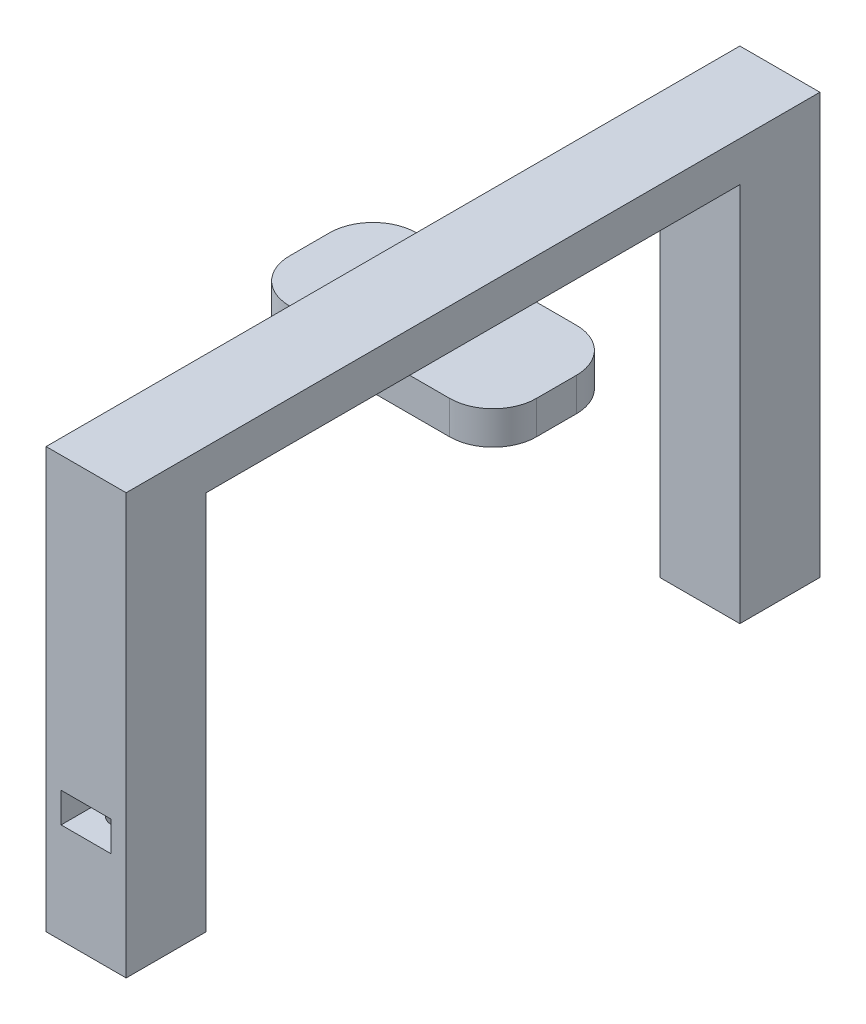
ISO-10303-21;
HEADER;
FILE_DESCRIPTION(('STEP AP214'),'2;1');
FILE_NAME('part.step','',(''),(''),'','','');
FILE_SCHEMA(('AUTOMOTIVE_DESIGN { 1 0 10303 214 1 1 1 1 }'));
ENDSEC;
DATA;
#1=APPLICATION_CONTEXT('core data for automotive mechanical design processes');
#2=APPLICATION_PROTOCOL_DEFINITION('international standard','automotive_design',2000,#1);
#3=PRODUCT_CONTEXT('',#1,'mechanical');
#4=PRODUCT('Part','Part','',(#3));
#5=PRODUCT_RELATED_PRODUCT_CATEGORY('part','',(#4));
#6=PRODUCT_DEFINITION_FORMATION('','',#4);
#7=PRODUCT_DEFINITION_CONTEXT('part definition',#1,'design');
#8=PRODUCT_DEFINITION('design','',#6,#7);
#9=PRODUCT_DEFINITION_SHAPE('','',#8);
#10=(LENGTH_UNIT() NAMED_UNIT(*) SI_UNIT(.MILLI.,.METRE.));
#11=(NAMED_UNIT(*) PLANE_ANGLE_UNIT() SI_UNIT($,.RADIAN.));
#12=(NAMED_UNIT(*) SI_UNIT($,.STERADIAN.) SOLID_ANGLE_UNIT());
#13=UNCERTAINTY_MEASURE_WITH_UNIT(LENGTH_MEASURE(1.E-05),#10,'distance_accuracy_value','');
#14=(GEOMETRIC_REPRESENTATION_CONTEXT(3) GLOBAL_UNCERTAINTY_ASSIGNED_CONTEXT((#13)) GLOBAL_UNIT_ASSIGNED_CONTEXT((#10,
#11,#12)) REPRESENTATION_CONTEXT('',''));
#15=CARTESIAN_POINT('',(0.,0.,0.));
#16=DIRECTION('',(0.,0.,1.));
#17=DIRECTION('',(1.,0.,0.));
#18=AXIS2_PLACEMENT_3D('',#15,#16,#17);
#19=CARTESIAN_POINT('',(-4.86740694674023,-12.,-47.9324410330826));
#20=DIRECTION('',(0.,-1.,0.));
#21=DIRECTION('',(0.,0.,-1.));
#22=AXIS2_PLACEMENT_3D('',#19,#20,#21);
#23=CYLINDRICAL_SURFACE('',#22,2.2);
#24=CARTESIAN_POINT('',(-4.86740694674023,-52.,-47.9324410330826));
#25=DIRECTION('',(0.,-1.,0.));
#26=DIRECTION('',(0.,0.,-1.));
#27=AXIS2_PLACEMENT_3D('',#24,#25,#26);
#28=CIRCLE('',#27,2.2);
#29=CARTESIAN_POINT('',(-4.86740694674023,-52.,-50.1324410330826));
#30=VERTEX_POINT('',#29);
#31=EDGE_CURVE('E279',#30,#30,#28,.T.);
#32=ORIENTED_EDGE('',*,*,#31,.T.);
#33=EDGE_LOOP('',(#32));
#34=FACE_BOUND('',#33,.T.);
#35=CARTESIAN_POINT('',(-4.86740694674023,-37.,-47.9324410330826));
#36=DIRECTION('',(0.,1.,0.));
#37=DIRECTION('',(0.,0.,1.));
#38=AXIS2_PLACEMENT_3D('',#35,#36,#37);
#39=CIRCLE('',#38,2.2);
#40=CARTESIAN_POINT('',(-4.86740694674023,-37.,-45.7324410330826));
#41=VERTEX_POINT('',#40);
#42=EDGE_CURVE('E39',#41,#41,#39,.F.);
#43=ORIENTED_EDGE('',*,*,#42,.F.);
#44=EDGE_LOOP('',(#43));
#45=FACE_BOUND('',#44,.T.);
#46=ADVANCED_FACE('F35',(#34,#45),#23,.F.);
#47=CARTESIAN_POINT('',(-4.86740694674023,-12.,44.0675589669174));
#48=DIRECTION('',(0.,-1.,0.));
#49=DIRECTION('',(0.,0.,-1.));
#50=AXIS2_PLACEMENT_3D('',#47,#48,#49);
#51=CYLINDRICAL_SURFACE('',#50,2.2);
#52=CARTESIAN_POINT('',(-4.86740694674023,-52.,44.0675589669174));
#53=DIRECTION('',(0.,-1.,0.));
#54=DIRECTION('',(0.,0.,-1.));
#55=AXIS2_PLACEMENT_3D('',#52,#53,#54);
#56=CIRCLE('',#55,2.2);
#57=CARTESIAN_POINT('',(-4.86740694674023,-52.,41.8675589669174));
#58=VERTEX_POINT('',#57);
#59=EDGE_CURVE('E282',#58,#58,#56,.T.);
#60=ORIENTED_EDGE('',*,*,#59,.T.);
#61=EDGE_LOOP('',(#60));
#62=FACE_BOUND('',#61,.T.);
#63=CARTESIAN_POINT('',(-4.86740694674023,-37.,44.0675589669174));
#64=DIRECTION('',(0.,1.,0.));
#65=DIRECTION('',(-1.,0.,0.));
#66=AXIS2_PLACEMENT_3D('',#63,#64,#65);
#67=CIRCLE('',#66,2.2);
#68=CARTESIAN_POINT('',(-7.06740694674023,-37.,44.0675589669174));
#69=VERTEX_POINT('',#68);
#70=EDGE_CURVE('E286',#69,#69,#67,.F.);
#71=ORIENTED_EDGE('',*,*,#70,.F.);
#72=EDGE_LOOP('',(#71));
#73=FACE_BOUND('',#72,.T.);
#74=ADVANCED_FACE('F431',(#62,#73),#51,.F.);
#75=CARTESIAN_POINT('',(0.,5.,0.));
#76=DIRECTION('',(0.,1.,0.));
#77=DIRECTION('',(0.,0.,1.));
#78=AXIS2_PLACEMENT_3D('',#75,#76,#77);
#79=PLANE('',#78);
#80=DIRECTION('',(-1.,0.,0.));
#81=VECTOR('',#80,1.);
#82=CARTESIAN_POINT('',(0.,5.,-41.9324410330826));
#83=LINE('',#82,#81);
#84=CARTESIAN_POINT('',(1.13259305325977,5.,-41.9324410330825));
#85=VERTEX_POINT('',#84);
#86=CARTESIAN_POINT('',(-10.8674069467402,5.,-41.9324410330825));
#87=VERTEX_POINT('',#86);
#88=EDGE_CURVE('E302',#85,#87,#83,.T.);
#89=ORIENTED_EDGE('',*,*,#88,.F.);
#90=DIRECTION('',(0.,0.,-1.));
#91=VECTOR('',#90,1.);
#92=CARTESIAN_POINT('',(1.13259305325977,5.,50.0675589669174));
#93=LINE('',#92,#91);
#94=CARTESIAN_POINT('',(1.13259305325977,5.,-11.4324410330825));
#95=VERTEX_POINT('',#94);
#96=EDGE_CURVE('E332',#95,#85,#93,.T.);
#97=ORIENTED_EDGE('',*,*,#96,.F.);
#98=DIRECTION('',(-1.,0.,0.));
#99=VECTOR('',#98,1.);
#100=CARTESIAN_POINT('',(-23.3674069467402,5.,-11.4324410330826));
#101=LINE('',#100,#99);
#102=CARTESIAN_POINT('',(-10.8674069467402,5.,-11.4324410330826));
#103=VERTEX_POINT('',#102);
#104=EDGE_CURVE('E371',#95,#103,#101,.T.);
#105=ORIENTED_EDGE('',*,*,#104,.T.);
#106=DIRECTION('',(0.,0.,-1.));
#107=VECTOR('',#106,1.);
#108=CARTESIAN_POINT('',(-10.8674069467402,5.,50.0675589669174));
#109=LINE('',#108,#107);
#110=EDGE_CURVE('E47',#103,#87,#109,.T.);
#111=ORIENTED_EDGE('',*,*,#110,.T.);
#112=EDGE_LOOP('',(#89,#97,#105,#111));
#113=FACE_BOUND('',#112,.T.);
#114=ADVANCED_FACE('F438',(#113),#79,.F.);
#115=CARTESIAN_POINT('',(0.,5.,0.));
#116=DIRECTION('',(0.,1.,0.));
#117=DIRECTION('',(0.,0.,1.));
#118=AXIS2_PLACEMENT_3D('',#115,#116,#117);
#119=PLANE('',#118);
#120=DIRECTION('',(1.,0.,0.));
#121=VECTOR('',#120,1.);
#122=CARTESIAN_POINT('',(-23.3674069467402,5.,7.56755896691743));
#123=LINE('',#122,#121);
#124=CARTESIAN_POINT('',(-16.8674069467402,5.,7.56755896691743));
#125=VERTEX_POINT('',#124);
#126=CARTESIAN_POINT('',(-10.8674069467402,5.,7.56755896691743));
#127=VERTEX_POINT('',#126);
#128=EDGE_CURVE('E360',#125,#127,#123,.T.);
#129=ORIENTED_EDGE('',*,*,#128,.T.);
#130=EDGE_CURVE('E11',#127,#103,#109,.T.);
#131=ORIENTED_EDGE('',*,*,#130,.T.);
#132=CARTESIAN_POINT('',(-16.8674069467402,5.,-11.4324410330826));
#133=VERTEX_POINT('',#132);
#134=EDGE_CURVE('E367',#103,#133,#101,.T.);
#135=ORIENTED_EDGE('',*,*,#134,.T.);
#136=CARTESIAN_POINT('',(-16.8674069467402,5.,-4.93244103308257));
#137=DIRECTION('',(0.,1.,0.));
#138=DIRECTION('',(0.,0.,1.));
#139=AXIS2_PLACEMENT_3D('',#136,#137,#138);
#140=CIRCLE('',#139,6.5);
#141=CARTESIAN_POINT('',(-23.3674069467402,5.,-4.93244103308256));
#142=VERTEX_POINT('',#141);
#143=EDGE_CURVE('E406',#133,#142,#140,.T.);
#144=ORIENTED_EDGE('',*,*,#143,.T.);
#145=DIRECTION('',(0.,0.,1.));
#146=VECTOR('',#145,1.);
#147=CARTESIAN_POINT('',(-23.3674069467402,5.,-11.4324410330826));
#148=LINE('',#147,#146);
#149=CARTESIAN_POINT('',(-23.3674069467402,5.,1.06755896691744));
#150=VERTEX_POINT('',#149);
#151=EDGE_CURVE('E355',#142,#150,#148,.T.);
#152=ORIENTED_EDGE('',*,*,#151,.T.);
#153=CARTESIAN_POINT('',(-16.8674069467402,5.,1.06755896691743));
#154=DIRECTION('',(0.,1.,0.));
#155=DIRECTION('',(0.,0.,1.));
#156=AXIS2_PLACEMENT_3D('',#153,#154,#155);
#157=CIRCLE('',#156,6.5);
#158=EDGE_CURVE('E400',#150,#125,#157,.T.);
#159=ORIENTED_EDGE('',*,*,#158,.T.);
#160=EDGE_LOOP('',(#129,#131,#135,#144,#152,#159));
#161=FACE_BOUND('',#160,.T.);
#162=ADVANCED_FACE('F489',(#161),#119,.T.);
#163=CARTESIAN_POINT('',(-23.3674069467402,5.,-11.4324410330826));
#164=DIRECTION('',(1.,0.,0.));
#165=DIRECTION('',(0.,0.,-1.));
#166=AXIS2_PLACEMENT_3D('',#163,#164,#165);
#167=PLANE('',#166);
#168=ORIENTED_EDGE('',*,*,#151,.F.);
#169=DIRECTION('',(0.,-1.,0.));
#170=VECTOR('',#169,1.);
#171=CARTESIAN_POINT('',(-23.3674069467402,5.,-4.93244103308256));
#172=LINE('',#171,#170);
#173=CARTESIAN_POINT('',(-23.3674069467402,0.,-4.93244103308256));
#174=VERTEX_POINT('',#173);
#175=EDGE_CURVE('E383',#142,#174,#172,.T.);
#176=ORIENTED_EDGE('',*,*,#175,.T.);
#177=DIRECTION('',(0.,0.,1.));
#178=VECTOR('',#177,1.);
#179=CARTESIAN_POINT('',(-23.3674069467402,0.,-11.4324410330826));
#180=LINE('',#179,#178);
#181=CARTESIAN_POINT('',(-23.3674069467402,0.,1.06755896691744));
#182=VERTEX_POINT('',#181);
#183=EDGE_CURVE('E354',#174,#182,#180,.T.);
#184=ORIENTED_EDGE('',*,*,#183,.T.);
#185=DIRECTION('',(0.,-1.,0.));
#186=VECTOR('',#185,1.);
#187=CARTESIAN_POINT('',(-23.3674069467402,5.,1.06755896691744));
#188=LINE('',#187,#186);
#189=EDGE_CURVE('E370',#182,#150,#188,.F.);
#190=ORIENTED_EDGE('',*,*,#189,.T.);
#191=EDGE_LOOP('',(#168,#176,#184,#190));
#192=FACE_BOUND('',#191,.T.);
#193=ADVANCED_FACE('F527',(#192),#167,.F.);
#194=CARTESIAN_POINT('',(-23.3674069467402,5.,7.56755896691743));
#195=DIRECTION('',(0.,0.,-1.));
#196=DIRECTION('',(-1.,0.,0.));
#197=AXIS2_PLACEMENT_3D('',#194,#195,#196);
#198=PLANE('',#197);
#199=DIRECTION('',(1.,0.,0.));
#200=VECTOR('',#199,1.);
#201=CARTESIAN_POINT('',(-23.3674069467402,0.,7.56755896691743));
#202=LINE('',#201,#200);
#203=CARTESIAN_POINT('',(-16.8674069467402,0.,7.56755896691743));
#204=VERTEX_POINT('',#203);
#205=CARTESIAN_POINT('',(7.13259305325977,0.,7.56755896691743));
#206=VERTEX_POINT('',#205);
#207=EDGE_CURVE('E374',#204,#206,#202,.T.);
#208=ORIENTED_EDGE('',*,*,#207,.T.);
#209=DIRECTION('',(0.,-1.,0.));
#210=VECTOR('',#209,1.);
#211=CARTESIAN_POINT('',(7.13259305325977,5.,7.56755896691743));
#212=LINE('',#211,#210);
#213=CARTESIAN_POINT('',(7.13259305325977,5.,7.56755896691743));
#214=VERTEX_POINT('',#213);
#215=EDGE_CURVE('E416',#206,#214,#212,.F.);
#216=ORIENTED_EDGE('',*,*,#215,.T.);
#217=CARTESIAN_POINT('',(1.13259305325977,5.,7.56755896691743));
#218=VERTEX_POINT('',#217);
#219=EDGE_CURVE('E358',#218,#214,#123,.T.);
#220=ORIENTED_EDGE('',*,*,#219,.F.);
#221=EDGE_CURVE('E364',#127,#218,#123,.T.);
#222=ORIENTED_EDGE('',*,*,#221,.F.);
#223=ORIENTED_EDGE('',*,*,#128,.F.);
#224=DIRECTION('',(0.,-1.,0.));
#225=VECTOR('',#224,1.);
#226=CARTESIAN_POINT('',(-16.8674069467402,5.,7.56755896691743));
#227=LINE('',#226,#225);
#228=EDGE_CURVE('E413',#125,#204,#227,.T.);
#229=ORIENTED_EDGE('',*,*,#228,.T.);
#230=EDGE_LOOP('',(#208,#216,#220,#222,#223,#229));
#231=FACE_BOUND('',#230,.T.);
#232=ADVANCED_FACE('F523',(#231),#198,.F.);
#233=CARTESIAN_POINT('',(13.6325930532598,5.,-11.4324410330826));
#234=DIRECTION('',(-1.,0.,0.));
#235=DIRECTION('',(0.,0.,1.));
#236=AXIS2_PLACEMENT_3D('',#233,#234,#235);
#237=PLANE('',#236);
#238=DIRECTION('',(0.,0.,-1.));
#239=VECTOR('',#238,1.);
#240=CARTESIAN_POINT('',(13.6325930532598,0.,-11.4324410330826));
#241=LINE('',#240,#239);
#242=CARTESIAN_POINT('',(13.6325930532598,0.,1.06755896691743));
#243=VERTEX_POINT('',#242);
#244=CARTESIAN_POINT('',(13.6325930532598,0.,-4.93244103308256));
#245=VERTEX_POINT('',#244);
#246=EDGE_CURVE('E377',#243,#245,#241,.T.);
#247=ORIENTED_EDGE('',*,*,#246,.T.);
#248=DIRECTION('',(0.,-1.,0.));
#249=VECTOR('',#248,1.);
#250=CARTESIAN_POINT('',(13.6325930532598,5.,-4.93244103308256));
#251=LINE('',#250,#249);
#252=CARTESIAN_POINT('',(13.6325930532598,5.,-4.93244103308256));
#253=VERTEX_POINT('',#252);
#254=EDGE_CURVE('E411',#245,#253,#251,.F.);
#255=ORIENTED_EDGE('',*,*,#254,.T.);
#256=DIRECTION('',(0.,0.,-1.));
#257=VECTOR('',#256,1.);
#258=CARTESIAN_POINT('',(13.6325930532598,5.,-11.4324410330826));
#259=LINE('',#258,#257);
#260=CARTESIAN_POINT('',(13.6325930532598,5.,1.06755896691743));
#261=VERTEX_POINT('',#260);
#262=EDGE_CURVE('E363',#261,#253,#259,.T.);
#263=ORIENTED_EDGE('',*,*,#262,.F.);
#264=DIRECTION('',(0.,-1.,0.));
#265=VECTOR('',#264,1.);
#266=CARTESIAN_POINT('',(13.6325930532598,5.,1.06755896691743));
#267=LINE('',#266,#265);
#268=EDGE_CURVE('E408',#261,#243,#267,.T.);
#269=ORIENTED_EDGE('',*,*,#268,.T.);
#270=EDGE_LOOP('',(#247,#255,#263,#269));
#271=FACE_BOUND('',#270,.T.);
#272=ADVANCED_FACE('F519',(#271),#237,.F.);
#273=CARTESIAN_POINT('',(-23.3674069467402,5.,-11.4324410330826));
#274=DIRECTION('',(0.,0.,1.));
#275=DIRECTION('',(1.,0.,0.));
#276=AXIS2_PLACEMENT_3D('',#273,#274,#275);
#277=PLANE('',#276);
#278=DIRECTION('',(-1.,0.,0.));
#279=VECTOR('',#278,1.);
#280=CARTESIAN_POINT('',(-23.3674069467402,0.,-11.4324410330826));
#281=LINE('',#280,#279);
#282=CARTESIAN_POINT('',(7.13259305325978,0.,-11.4324410330826));
#283=VERTEX_POINT('',#282);
#284=CARTESIAN_POINT('',(-16.8674069467402,0.,-11.4324410330826));
#285=VERTEX_POINT('',#284);
#286=EDGE_CURVE('E359',#283,#285,#281,.T.);
#287=ORIENTED_EDGE('',*,*,#286,.T.);
#288=DIRECTION('',(0.,-1.,0.));
#289=VECTOR('',#288,1.);
#290=CARTESIAN_POINT('',(-16.8674069467402,5.,-11.4324410330826));
#291=LINE('',#290,#289);
#292=EDGE_CURVE('E397',#285,#133,#291,.F.);
#293=ORIENTED_EDGE('',*,*,#292,.T.);
#294=ORIENTED_EDGE('',*,*,#134,.F.);
#295=ORIENTED_EDGE('',*,*,#104,.F.);
#296=CARTESIAN_POINT('',(7.13259305325978,5.,-11.4324410330826));
#297=VERTEX_POINT('',#296);
#298=EDGE_CURVE('E368',#297,#95,#101,.T.);
#299=ORIENTED_EDGE('',*,*,#298,.F.);
#300=DIRECTION('',(0.,-1.,0.));
#301=VECTOR('',#300,1.);
#302=CARTESIAN_POINT('',(7.13259305325978,5.,-11.4324410330826));
#303=LINE('',#302,#301);
#304=EDGE_CURVE('E394',#297,#283,#303,.T.);
#305=ORIENTED_EDGE('',*,*,#304,.T.);
#306=EDGE_LOOP('',(#287,#293,#294,#295,#299,#305));
#307=FACE_BOUND('',#306,.T.);
#308=ADVANCED_FACE('F511',(#307),#277,.F.);
#309=EDGE_CURVE('E44',#218,#95,#93,.T.);
#310=ORIENTED_EDGE('',*,*,#309,.F.);
#311=ORIENTED_EDGE('',*,*,#219,.T.);
#312=CARTESIAN_POINT('',(7.13259305325977,5.,1.06755896691743));
#313=DIRECTION('',(0.,1.,0.));
#314=DIRECTION('',(0.,0.,1.));
#315=AXIS2_PLACEMENT_3D('',#312,#313,#314);
#316=CIRCLE('',#315,6.5);
#317=EDGE_CURVE('E402',#214,#261,#316,.T.);
#318=ORIENTED_EDGE('',*,*,#317,.T.);
#319=ORIENTED_EDGE('',*,*,#262,.T.);
#320=CARTESIAN_POINT('',(7.13259305325978,5.,-4.93244103308257));
#321=DIRECTION('',(0.,1.,0.));
#322=DIRECTION('',(0.,0.,1.));
#323=AXIS2_PLACEMENT_3D('',#320,#321,#322);
#324=CIRCLE('',#323,6.5);
#325=EDGE_CURVE('E404',#253,#297,#324,.T.);
#326=ORIENTED_EDGE('',*,*,#325,.T.);
#327=ORIENTED_EDGE('',*,*,#298,.T.);
#328=EDGE_LOOP('',(#310,#311,#318,#319,#326,#327));
#329=FACE_BOUND('',#328,.T.);
#330=ADVANCED_FACE('F507',(#329),#119,.T.);
#331=CARTESIAN_POINT('',(0.,0.,0.));
#332=DIRECTION('',(0.,1.,0.));
#333=DIRECTION('',(0.,0.,1.));
#334=AXIS2_PLACEMENT_3D('',#331,#332,#333);
#335=PLANE('',#334);
#336=ORIENTED_EDGE('',*,*,#183,.F.);
#337=CARTESIAN_POINT('',(-16.8674069467402,0.,-4.93244103308257));
#338=DIRECTION('',(0.,1.,0.));
#339=DIRECTION('',(0.,0.,1.));
#340=AXIS2_PLACEMENT_3D('',#337,#338,#339);
#341=CIRCLE('',#340,6.5);
#342=EDGE_CURVE('E392',#174,#285,#341,.F.);
#343=ORIENTED_EDGE('',*,*,#342,.T.);
#344=ORIENTED_EDGE('',*,*,#286,.F.);
#345=CARTESIAN_POINT('',(7.13259305325978,0.,-4.93244103308257));
#346=DIRECTION('',(0.,1.,0.));
#347=DIRECTION('',(0.,0.,1.));
#348=AXIS2_PLACEMENT_3D('',#345,#346,#347);
#349=CIRCLE('',#348,6.5);
#350=EDGE_CURVE('E390',#283,#245,#349,.F.);
#351=ORIENTED_EDGE('',*,*,#350,.T.);
#352=ORIENTED_EDGE('',*,*,#246,.F.);
#353=CARTESIAN_POINT('',(7.13259305325977,0.,1.06755896691743));
#354=DIRECTION('',(0.,1.,0.));
#355=DIRECTION('',(0.,0.,1.));
#356=AXIS2_PLACEMENT_3D('',#353,#354,#355);
#357=CIRCLE('',#356,6.5);
#358=EDGE_CURVE('E388',#243,#206,#357,.F.);
#359=ORIENTED_EDGE('',*,*,#358,.T.);
#360=ORIENTED_EDGE('',*,*,#207,.F.);
#361=CARTESIAN_POINT('',(-16.8674069467402,0.,1.06755896691743));
#362=DIRECTION('',(0.,1.,0.));
#363=DIRECTION('',(0.,0.,1.));
#364=AXIS2_PLACEMENT_3D('',#361,#362,#363);
#365=CIRCLE('',#364,6.5);
#366=EDGE_CURVE('E386',#204,#182,#365,.F.);
#367=ORIENTED_EDGE('',*,*,#366,.T.);
#368=EDGE_LOOP('',(#336,#343,#344,#351,#352,#359,#360,#367));
#369=FACE_BOUND('',#368,.T.);
#370=ADVANCED_FACE('F510',(#369),#335,.F.);
#371=CARTESIAN_POINT('',(-16.8674069467402,5.,-4.93244103308257));
#372=DIRECTION('',(0.,-1.,0.));
#373=DIRECTION('',(0.,0.,-1.));
#374=AXIS2_PLACEMENT_3D('',#371,#372,#373);
#375=CYLINDRICAL_SURFACE('',#374,6.5);
#376=ORIENTED_EDGE('',*,*,#143,.F.);
#377=ORIENTED_EDGE('',*,*,#292,.F.);
#378=ORIENTED_EDGE('',*,*,#342,.F.);
#379=ORIENTED_EDGE('',*,*,#175,.F.);
#380=EDGE_LOOP('',(#376,#377,#378,#379));
#381=FACE_BOUND('',#380,.T.);
#382=ADVANCED_FACE('F515',(#381),#375,.T.);
#383=CARTESIAN_POINT('',(7.13259305325978,5.,-4.93244103308257));
#384=DIRECTION('',(0.,-1.,0.));
#385=DIRECTION('',(0.,0.,-1.));
#386=AXIS2_PLACEMENT_3D('',#383,#384,#385);
#387=CYLINDRICAL_SURFACE('',#386,6.5);
#388=ORIENTED_EDGE('',*,*,#325,.F.);
#389=ORIENTED_EDGE('',*,*,#254,.F.);
#390=ORIENTED_EDGE('',*,*,#350,.F.);
#391=ORIENTED_EDGE('',*,*,#304,.F.);
#392=EDGE_LOOP('',(#388,#389,#390,#391));
#393=FACE_BOUND('',#392,.T.);
#394=ADVANCED_FACE('F534',(#393),#387,.T.);
#395=CARTESIAN_POINT('',(7.13259305325977,5.,1.06755896691743));
#396=DIRECTION('',(0.,-1.,0.));
#397=DIRECTION('',(0.,0.,-1.));
#398=AXIS2_PLACEMENT_3D('',#395,#396,#397);
#399=CYLINDRICAL_SURFACE('',#398,6.5);
#400=ORIENTED_EDGE('',*,*,#317,.F.);
#401=ORIENTED_EDGE('',*,*,#215,.F.);
#402=ORIENTED_EDGE('',*,*,#358,.F.);
#403=ORIENTED_EDGE('',*,*,#268,.F.);
#404=EDGE_LOOP('',(#400,#401,#402,#403));
#405=FACE_BOUND('',#404,.T.);
#406=ADVANCED_FACE('F537',(#405),#399,.T.);
#407=CARTESIAN_POINT('',(-16.8674069467402,5.,1.06755896691743));
#408=DIRECTION('',(0.,-1.,0.));
#409=DIRECTION('',(0.,0.,-1.));
#410=AXIS2_PLACEMENT_3D('',#407,#408,#409);
#411=CYLINDRICAL_SURFACE('',#410,6.5);
#412=ORIENTED_EDGE('',*,*,#158,.F.);
#413=ORIENTED_EDGE('',*,*,#189,.F.);
#414=ORIENTED_EDGE('',*,*,#366,.F.);
#415=ORIENTED_EDGE('',*,*,#228,.F.);
#416=EDGE_LOOP('',(#412,#413,#414,#415));
#417=FACE_BOUND('',#416,.T.);
#418=ADVANCED_FACE('F37',(#417),#411,.T.);
#419=CARTESIAN_POINT('',(1.13259305325977,5.,38.0675589669174));
#420=VERTEX_POINT('',#419);
#421=EDGE_CURVE('E345',#420,#218,#93,.T.);
#422=ORIENTED_EDGE('',*,*,#421,.F.);
#423=DIRECTION('',(-1.,0.,0.));
#424=VECTOR('',#423,1.);
#425=CARTESIAN_POINT('',(1.13259305325977,5.,38.0675589669174));
#426=LINE('',#425,#424);
#427=CARTESIAN_POINT('',(-10.8674069467402,5.,38.0675589669174));
#428=VERTEX_POINT('',#427);
#429=EDGE_CURVE('E299',#420,#428,#426,.T.);
#430=ORIENTED_EDGE('',*,*,#429,.T.);
#431=EDGE_CURVE('E46',#428,#127,#109,.T.);
#432=ORIENTED_EDGE('',*,*,#431,.T.);
#433=ORIENTED_EDGE('',*,*,#221,.T.);
#434=EDGE_LOOP('',(#422,#430,#432,#433));
#435=FACE_BOUND('',#434,.T.);
#436=ADVANCED_FACE('F491',(#435),#79,.F.);
#437=CARTESIAN_POINT('',(-10.8674069467402,11.,50.0675589669174));
#438=DIRECTION('',(0.,0.,-1.));
#439=DIRECTION('',(-1.,0.,0.));
#440=AXIS2_PLACEMENT_3D('',#437,#438,#439);
#441=PLANE('',#440);
#442=DIRECTION('',(-1.,0.,0.));
#443=VECTOR('',#442,1.);
#444=CARTESIAN_POINT('',(-1.11740694674023,-32.5,50.0675589669174));
#445=LINE('',#444,#443);
#446=CARTESIAN_POINT('',(-1.11740694674023,-32.5,50.0675589669174));
#447=VERTEX_POINT('',#446);
#448=CARTESIAN_POINT('',(-8.61740694674022,-32.5,50.0675589669174));
#449=VERTEX_POINT('',#448);
#450=EDGE_CURVE('E263',#447,#449,#445,.T.);
#451=ORIENTED_EDGE('',*,*,#450,.F.);
#452=DIRECTION('',(0.,1.,0.));
#453=VECTOR('',#452,1.);
#454=CARTESIAN_POINT('',(-1.11740694674023,-37.,50.0675589669174));
#455=LINE('',#454,#453);
#456=CARTESIAN_POINT('',(-1.11740694674023,-37.,50.0675589669174));
#457=VERTEX_POINT('',#456);
#458=EDGE_CURVE('E62',#457,#447,#455,.T.);
#459=ORIENTED_EDGE('',*,*,#458,.F.);
#460=DIRECTION('',(-1.,0.,0.));
#461=VECTOR('',#460,1.);
#462=CARTESIAN_POINT('',(-1.11740694674023,-37.,50.0675589669174));
#463=LINE('',#462,#461);
#464=CARTESIAN_POINT('',(-8.61740694674022,-37.,50.0675589669174));
#465=VERTEX_POINT('',#464);
#466=EDGE_CURVE('E254',#457,#465,#463,.T.);
#467=ORIENTED_EDGE('',*,*,#466,.T.);
#468=DIRECTION('',(0.,1.,0.));
#469=VECTOR('',#468,1.);
#470=CARTESIAN_POINT('',(-8.61740694674022,-37.,50.0675589669174));
#471=LINE('',#470,#469);
#472=EDGE_CURVE('E266',#465,#449,#471,.T.);
#473=ORIENTED_EDGE('',*,*,#472,.T.);
#474=EDGE_LOOP('',(#451,#459,#467,#473));
#475=FACE_BOUND('',#474,.T.);
#476=DIRECTION('',(0.,-1.,0.));
#477=VECTOR('',#476,1.);
#478=CARTESIAN_POINT('',(-10.8674069467402,11.,50.0675589669174));
#479=LINE('',#478,#477);
#480=CARTESIAN_POINT('',(-10.8674069467402,11.,50.0675589669174));
#481=VERTEX_POINT('',#480);
#482=CARTESIAN_POINT('',(-10.8674069467402,-52.,50.0675589669174));
#483=VERTEX_POINT('',#482);
#484=EDGE_CURVE('E344',#481,#483,#479,.T.);
#485=ORIENTED_EDGE('',*,*,#484,.T.);
#486=DIRECTION('',(-1.,0.,0.));
#487=VECTOR('',#486,1.);
#488=CARTESIAN_POINT('',(1.13259305325977,-52.,50.0675589669174));
#489=LINE('',#488,#487);
#490=CARTESIAN_POINT('',(1.13259305325977,-52.,50.0675589669174));
#491=VERTEX_POINT('',#490);
#492=EDGE_CURVE('E296',#491,#483,#489,.T.);
#493=ORIENTED_EDGE('',*,*,#492,.F.);
#494=DIRECTION('',(0.,-1.,0.));
#495=VECTOR('',#494,1.);
#496=CARTESIAN_POINT('',(1.13259305325977,11.,50.0675589669174));
#497=LINE('',#496,#495);
#498=CARTESIAN_POINT('',(1.13259305325977,11.,50.0675589669174));
#499=VERTEX_POINT('',#498);
#500=EDGE_CURVE('E352',#499,#491,#497,.T.);
#501=ORIENTED_EDGE('',*,*,#500,.F.);
#502=DIRECTION('',(1.,0.,0.));
#503=VECTOR('',#502,1.);
#504=CARTESIAN_POINT('',(-10.8674069467402,11.,50.0675589669174));
#505=LINE('',#504,#503);
#506=EDGE_CURVE('E333',#481,#499,#505,.T.);
#507=ORIENTED_EDGE('',*,*,#506,.F.);
#508=EDGE_LOOP('',(#485,#493,#501,#507));
#509=FACE_BOUND('',#508,.T.);
#510=ADVANCED_FACE('F502',(#475,#509),#441,.F.);
#511=CARTESIAN_POINT('',(1.13259305325977,11.,50.0675589669174));
#512=DIRECTION('',(-1.,0.,0.));
#513=DIRECTION('',(0.,0.,1.));
#514=AXIS2_PLACEMENT_3D('',#511,#512,#513);
#515=PLANE('',#514);
#516=ORIENTED_EDGE('',*,*,#500,.T.);
#517=DIRECTION('',(0.,0.,-1.));
#518=VECTOR('',#517,1.);
#519=CARTESIAN_POINT('',(1.13259305325977,-52.,50.0675589669174));
#520=LINE('',#519,#518);
#521=CARTESIAN_POINT('',(1.13259305325977,-52.,38.0675589669174));
#522=VERTEX_POINT('',#521);
#523=EDGE_CURVE('E303',#491,#522,#520,.T.);
#524=ORIENTED_EDGE('',*,*,#523,.T.);
#525=DIRECTION('',(0.,1.,0.));
#526=VECTOR('',#525,1.);
#527=CARTESIAN_POINT('',(1.13259305325977,-52.,38.0675589669174));
#528=LINE('',#527,#526);
#529=EDGE_CURVE('E293',#522,#420,#528,.T.);
#530=ORIENTED_EDGE('',*,*,#529,.T.);
#531=ORIENTED_EDGE('',*,*,#421,.T.);
#532=ORIENTED_EDGE('',*,*,#309,.T.);
#533=ORIENTED_EDGE('',*,*,#96,.T.);
#534=DIRECTION('',(0.,1.,0.));
#535=VECTOR('',#534,1.);
#536=CARTESIAN_POINT('',(1.13259305325977,-52.,-41.9324410330826));
#537=LINE('',#536,#535);
#538=CARTESIAN_POINT('',(1.13259305325977,-52.,-41.9324410330826));
#539=VERTEX_POINT('',#538);
#540=EDGE_CURVE('E329',#539,#85,#537,.T.);
#541=ORIENTED_EDGE('',*,*,#540,.F.);
#542=DIRECTION('',(0.,0.,1.));
#543=VECTOR('',#542,1.);
#544=CARTESIAN_POINT('',(1.13259305325977,-52.,0.));
#545=LINE('',#544,#543);
#546=CARTESIAN_POINT('',(1.13259305325977,-52.,-53.9324410330826));
#547=VERTEX_POINT('',#546);
#548=EDGE_CURVE('E313',#547,#539,#545,.T.);
#549=ORIENTED_EDGE('',*,*,#548,.F.);
#550=DIRECTION('',(0.,-1.,0.));
#551=VECTOR('',#550,1.);
#552=CARTESIAN_POINT('',(1.13259305325977,11.,-53.9324410330826));
#553=LINE('',#552,#551);
#554=CARTESIAN_POINT('',(1.13259305325977,11.,-53.9324410330826));
#555=VERTEX_POINT('',#554);
#556=EDGE_CURVE('E350',#555,#547,#553,.T.);
#557=ORIENTED_EDGE('',*,*,#556,.F.);
#558=DIRECTION('',(0.,0.,-1.));
#559=VECTOR('',#558,1.);
#560=CARTESIAN_POINT('',(1.13259305325977,11.,50.0675589669174));
#561=LINE('',#560,#559);
#562=EDGE_CURVE('E336',#499,#555,#561,.T.);
#563=ORIENTED_EDGE('',*,*,#562,.F.);
#564=EDGE_LOOP('',(#516,#524,#530,#531,#532,#533,#541,#549,#557,#563));
#565=FACE_BOUND('',#564,.T.);
#566=ADVANCED_FACE('F498',(#565),#515,.F.);
#567=CARTESIAN_POINT('',(-10.8674069467402,11.,-53.9324410330826));
#568=DIRECTION('',(0.,0.,-1.));
#569=DIRECTION('',(-1.,0.,0.));
#570=AXIS2_PLACEMENT_3D('',#567,#568,#569);
#571=PLANE('',#570);
#572=DIRECTION('',(0.,1.,0.));
#573=VECTOR('',#572,1.);
#574=CARTESIAN_POINT('',(-8.61740694674022,-37.,-53.9324410330826));
#575=LINE('',#574,#573);
#576=CARTESIAN_POINT('',(-8.61740694674022,-37.,-53.9324410330826));
#577=VERTEX_POINT('',#576);
#578=CARTESIAN_POINT('',(-8.61740694674022,-32.5,-53.9324410330826));
#579=VERTEX_POINT('',#578);
#580=EDGE_CURVE('E54',#577,#579,#575,.T.);
#581=ORIENTED_EDGE('',*,*,#580,.F.);
#582=DIRECTION('',(1.,0.,0.));
#583=VECTOR('',#582,1.);
#584=CARTESIAN_POINT('',(-8.61740694674022,-37.,-53.9324410330826));
#585=LINE('',#584,#583);
#586=CARTESIAN_POINT('',(-1.11740694674023,-37.,-53.9324410330826));
#587=VERTEX_POINT('',#586);
#588=EDGE_CURVE('E231',#577,#587,#585,.T.);
#589=ORIENTED_EDGE('',*,*,#588,.T.);
#590=DIRECTION('',(0.,1.,0.));
#591=VECTOR('',#590,1.);
#592=CARTESIAN_POINT('',(-1.11740694674023,-37.,-53.9324410330826));
#593=LINE('',#592,#591);
#594=CARTESIAN_POINT('',(-1.11740694674023,-32.5,-53.9324410330826));
#595=VERTEX_POINT('',#594);
#596=EDGE_CURVE('E234',#587,#595,#593,.T.);
#597=ORIENTED_EDGE('',*,*,#596,.T.);
#598=DIRECTION('',(1.,0.,0.));
#599=VECTOR('',#598,1.);
#600=CARTESIAN_POINT('',(-8.61740694674022,-32.5,-53.9324410330826));
#601=LINE('',#600,#599);
#602=EDGE_CURVE('E240',#579,#595,#601,.T.);
#603=ORIENTED_EDGE('',*,*,#602,.F.);
#604=EDGE_LOOP('',(#581,#589,#597,#603));
#605=FACE_BOUND('',#604,.T.);
#606=ORIENTED_EDGE('',*,*,#556,.T.);
#607=DIRECTION('',(1.,0.,0.));
#608=VECTOR('',#607,1.);
#609=CARTESIAN_POINT('',(0.,-52.,-53.9324410330826));
#610=LINE('',#609,#608);
#611=CARTESIAN_POINT('',(-10.8674069467402,-52.,-53.9324410330826));
#612=VERTEX_POINT('',#611);
#613=EDGE_CURVE('E321',#612,#547,#610,.T.);
#614=ORIENTED_EDGE('',*,*,#613,.F.);
#615=DIRECTION('',(0.,-1.,0.));
#616=VECTOR('',#615,1.);
#617=CARTESIAN_POINT('',(-10.8674069467402,11.,-53.9324410330826));
#618=LINE('',#617,#616);
#619=CARTESIAN_POINT('',(-10.8674069467402,11.,-53.9324410330826));
#620=VERTEX_POINT('',#619);
#621=EDGE_CURVE('E348',#620,#612,#618,.T.);
#622=ORIENTED_EDGE('',*,*,#621,.F.);
#623=DIRECTION('',(1.,0.,0.));
#624=VECTOR('',#623,1.);
#625=CARTESIAN_POINT('',(-10.8674069467402,11.,-53.9324410330826));
#626=LINE('',#625,#624);
#627=EDGE_CURVE('E338',#620,#555,#626,.T.);
#628=ORIENTED_EDGE('',*,*,#627,.T.);
#629=EDGE_LOOP('',(#606,#614,#622,#628));
#630=FACE_BOUND('',#629,.T.);
#631=ADVANCED_FACE('F494',(#605,#630),#571,.T.);
#632=CARTESIAN_POINT('',(-10.8674069467402,11.,50.0675589669174));
#633=DIRECTION('',(-1.,0.,0.));
#634=DIRECTION('',(0.,0.,1.));
#635=AXIS2_PLACEMENT_3D('',#632,#633,#634);
#636=PLANE('',#635);
#637=ORIENTED_EDGE('',*,*,#431,.F.);
#638=DIRECTION('',(0.,1.,0.));
#639=VECTOR('',#638,1.);
#640=CARTESIAN_POINT('',(-10.8674069467402,-52.,38.0675589669174));
#641=LINE('',#640,#639);
#642=CARTESIAN_POINT('',(-10.8674069467402,-52.,38.0675589669174));
#643=VERTEX_POINT('',#642);
#644=EDGE_CURVE('E290',#643,#428,#641,.T.);
#645=ORIENTED_EDGE('',*,*,#644,.F.);
#646=DIRECTION('',(0.,0.,-1.));
#647=VECTOR('',#646,1.);
#648=CARTESIAN_POINT('',(-10.8674069467402,-52.,50.0675589669174));
#649=LINE('',#648,#647);
#650=EDGE_CURVE('E306',#483,#643,#649,.T.);
#651=ORIENTED_EDGE('',*,*,#650,.F.);
#652=ORIENTED_EDGE('',*,*,#484,.F.);
#653=DIRECTION('',(0.,0.,-1.));
#654=VECTOR('',#653,1.);
#655=CARTESIAN_POINT('',(-10.8674069467402,11.,50.0675589669174));
#656=LINE('',#655,#654);
#657=EDGE_CURVE('E341',#481,#620,#656,.T.);
#658=ORIENTED_EDGE('',*,*,#657,.T.);
#659=ORIENTED_EDGE('',*,*,#621,.T.);
#660=DIRECTION('',(0.,0.,-1.));
#661=VECTOR('',#660,1.);
#662=CARTESIAN_POINT('',(-10.8674069467402,-52.,0.));
#663=LINE('',#662,#661);
#664=CARTESIAN_POINT('',(-10.8674069467402,-52.,-41.9324410330826));
#665=VERTEX_POINT('',#664);
#666=EDGE_CURVE('E318',#665,#612,#663,.T.);
#667=ORIENTED_EDGE('',*,*,#666,.F.);
#668=DIRECTION('',(0.,1.,0.));
#669=VECTOR('',#668,1.);
#670=CARTESIAN_POINT('',(-10.8674069467402,-52.,-41.9324410330826));
#671=LINE('',#670,#669);
#672=EDGE_CURVE('E324',#665,#87,#671,.T.);
#673=ORIENTED_EDGE('',*,*,#672,.T.);
#674=ORIENTED_EDGE('',*,*,#110,.F.);
#675=ORIENTED_EDGE('',*,*,#130,.F.);
#676=EDGE_LOOP('',(#637,#645,#651,#652,#658,#659,#667,#673,#674,#675));
#677=FACE_BOUND('',#676,.T.);
#678=ADVANCED_FACE('F485',(#677),#636,.T.);
#679=CARTESIAN_POINT('',(0.,11.,0.));
#680=DIRECTION('',(0.,1.,0.));
#681=DIRECTION('',(0.,0.,1.));
#682=AXIS2_PLACEMENT_3D('',#679,#680,#681);
#683=PLANE('',#682);
#684=ORIENTED_EDGE('',*,*,#506,.T.);
#685=ORIENTED_EDGE('',*,*,#562,.T.);
#686=ORIENTED_EDGE('',*,*,#627,.F.);
#687=ORIENTED_EDGE('',*,*,#657,.F.);
#688=EDGE_LOOP('',(#684,#685,#686,#687));
#689=FACE_BOUND('',#688,.T.);
#690=ADVANCED_FACE('F481',(#689),#683,.T.);
#691=CARTESIAN_POINT('',(0.,-52.,-41.9324410330826));
#692=DIRECTION('',(0.,0.,-1.));
#693=DIRECTION('',(-1.,0.,0.));
#694=AXIS2_PLACEMENT_3D('',#691,#692,#693);
#695=PLANE('',#694);
#696=ORIENTED_EDGE('',*,*,#88,.T.);
#697=ORIENTED_EDGE('',*,*,#672,.F.);
#698=DIRECTION('',(-1.,0.,0.));
#699=VECTOR('',#698,1.);
#700=CARTESIAN_POINT('',(0.,-52.,-41.9324410330826));
#701=LINE('',#700,#699);
#702=EDGE_CURVE('E316',#539,#665,#701,.T.);
#703=ORIENTED_EDGE('',*,*,#702,.F.);
#704=ORIENTED_EDGE('',*,*,#540,.T.);
#705=EDGE_LOOP('',(#696,#697,#703,#704));
#706=FACE_BOUND('',#705,.T.);
#707=ADVANCED_FACE('F477',(#706),#695,.F.);
#708=CARTESIAN_POINT('',(0.,-52.,0.));
#709=DIRECTION('',(0.,-1.,0.));
#710=DIRECTION('',(0.,0.,-1.));
#711=AXIS2_PLACEMENT_3D('',#708,#709,#710);
#712=PLANE('',#711);
#713=ORIENTED_EDGE('',*,*,#31,.F.);
#714=EDGE_LOOP('',(#713));
#715=FACE_BOUND('',#714,.T.);
#716=ORIENTED_EDGE('',*,*,#548,.T.);
#717=ORIENTED_EDGE('',*,*,#702,.T.);
#718=ORIENTED_EDGE('',*,*,#666,.T.);
#719=ORIENTED_EDGE('',*,*,#613,.T.);
#720=EDGE_LOOP('',(#716,#717,#718,#719));
#721=FACE_BOUND('',#720,.T.);
#722=ADVANCED_FACE('F469',(#715,#721),#712,.T.);
#723=CARTESIAN_POINT('',(1.13259305325977,-52.,38.0675589669174));
#724=DIRECTION('',(0.,0.,-1.));
#725=DIRECTION('',(-1.,0.,0.));
#726=AXIS2_PLACEMENT_3D('',#723,#724,#725);
#727=PLANE('',#726);
#728=ORIENTED_EDGE('',*,*,#429,.F.);
#729=ORIENTED_EDGE('',*,*,#529,.F.);
#730=DIRECTION('',(-1.,0.,0.));
#731=VECTOR('',#730,1.);
#732=CARTESIAN_POINT('',(1.13259305325977,-52.,38.0675589669174));
#733=LINE('',#732,#731);
#734=EDGE_CURVE('E308',#522,#643,#733,.T.);
#735=ORIENTED_EDGE('',*,*,#734,.T.);
#736=ORIENTED_EDGE('',*,*,#644,.T.);
#737=EDGE_LOOP('',(#728,#729,#735,#736));
#738=FACE_BOUND('',#737,.T.);
#739=ADVANCED_FACE('F465',(#738),#727,.T.);
#740=CARTESIAN_POINT('',(0.,-52.,0.));
#741=DIRECTION('',(0.,1.,0.));
#742=DIRECTION('',(0.,0.,1.));
#743=AXIS2_PLACEMENT_3D('',#740,#741,#742);
#744=PLANE('',#743);
#745=ORIENTED_EDGE('',*,*,#59,.F.);
#746=EDGE_LOOP('',(#745));
#747=FACE_BOUND('',#746,.T.);
#748=ORIENTED_EDGE('',*,*,#523,.F.);
#749=ORIENTED_EDGE('',*,*,#492,.T.);
#750=ORIENTED_EDGE('',*,*,#650,.T.);
#751=ORIENTED_EDGE('',*,*,#734,.F.);
#752=EDGE_LOOP('',(#748,#749,#750,#751));
#753=FACE_BOUND('',#752,.T.);
#754=ADVANCED_FACE('F468',(#747,#753),#744,.F.);
#755=CARTESIAN_POINT('',(-1.11740694674023,-37.,39.5675589669174));
#756=DIRECTION('',(0.,1.,0.));
#757=DIRECTION('',(-1.,0.,0.));
#758=AXIS2_PLACEMENT_3D('',#755,#756,#757);
#759=PLANE('',#758);
#760=ORIENTED_EDGE('',*,*,#466,.F.);
#761=DIRECTION('',(0.,0.,1.));
#762=VECTOR('',#761,1.);
#763=CARTESIAN_POINT('',(-1.11740694674023,-37.,39.5675589669174));
#764=LINE('',#763,#762);
#765=CARTESIAN_POINT('',(-1.11740694674023,-37.,39.5675589669174));
#766=VERTEX_POINT('',#765);
#767=EDGE_CURVE('E271',#766,#457,#764,.T.);
#768=ORIENTED_EDGE('',*,*,#767,.F.);
#769=DIRECTION('',(-1.,0.,0.));
#770=VECTOR('',#769,1.);
#771=CARTESIAN_POINT('',(-1.11740694674023,-37.,39.5675589669174));
#772=LINE('',#771,#770);
#773=CARTESIAN_POINT('',(-8.61740694674022,-37.,39.5675589669174));
#774=VERTEX_POINT('',#773);
#775=EDGE_CURVE('E259',#766,#774,#772,.T.);
#776=ORIENTED_EDGE('',*,*,#775,.T.);
#777=DIRECTION('',(0.,0.,1.));
#778=VECTOR('',#777,1.);
#779=CARTESIAN_POINT('',(-8.61740694674022,-37.,39.5675589669174));
#780=LINE('',#779,#778);
#781=EDGE_CURVE('E274',#774,#465,#780,.T.);
#782=ORIENTED_EDGE('',*,*,#781,.T.);
#783=EDGE_LOOP('',(#760,#768,#776,#782));
#784=FACE_BOUND('',#783,.T.);
#785=ORIENTED_EDGE('',*,*,#70,.T.);
#786=EDGE_LOOP('',(#785));
#787=FACE_BOUND('',#786,.T.);
#788=ADVANCED_FACE('F473',(#784,#787),#759,.T.);
#789=CARTESIAN_POINT('',(-1.11740694674023,-32.5,39.5675589669174));
#790=DIRECTION('',(0.,1.,0.));
#791=DIRECTION('',(0.,0.,1.));
#792=AXIS2_PLACEMENT_3D('',#789,#790,#791);
#793=PLANE('',#792);
#794=ORIENTED_EDGE('',*,*,#450,.T.);
#795=DIRECTION('',(0.,0.,1.));
#796=VECTOR('',#795,1.);
#797=CARTESIAN_POINT('',(-8.61740694674022,-32.5,39.5675589669174));
#798=LINE('',#797,#796);
#799=CARTESIAN_POINT('',(-8.61740694674022,-32.5,39.5675589669174));
#800=VERTEX_POINT('',#799);
#801=EDGE_CURVE('E276',#800,#449,#798,.T.);
#802=ORIENTED_EDGE('',*,*,#801,.F.);
#803=DIRECTION('',(-1.,0.,0.));
#804=VECTOR('',#803,1.);
#805=CARTESIAN_POINT('',(-1.11740694674023,-32.5,39.5675589669174));
#806=LINE('',#805,#804);
#807=CARTESIAN_POINT('',(-1.11740694674023,-32.5,39.5675589669174));
#808=VERTEX_POINT('',#807);
#809=EDGE_CURVE('E253',#808,#800,#806,.T.);
#810=ORIENTED_EDGE('',*,*,#809,.F.);
#811=DIRECTION('',(0.,0.,1.));
#812=VECTOR('',#811,1.);
#813=CARTESIAN_POINT('',(-1.11740694674023,-32.5,39.5675589669174));
#814=LINE('',#813,#812);
#815=EDGE_CURVE('E261',#808,#447,#814,.T.);
#816=ORIENTED_EDGE('',*,*,#815,.T.);
#817=EDGE_LOOP('',(#794,#802,#810,#816));
#818=FACE_BOUND('',#817,.T.);
#819=CARTESIAN_POINT('',(-4.86740694674023,-32.5,44.0675589669174));
#820=DIRECTION('',(0.,1.,0.));
#821=DIRECTION('',(0.,0.,1.));
#822=AXIS2_PLACEMENT_3D('',#819,#820,#821);
#823=CIRCLE('',#822,2.2);
#824=CARTESIAN_POINT('',(-4.86740694674023,-32.5,46.2675589669174));
#825=VERTEX_POINT('',#824);
#826=EDGE_CURVE('E273',#825,#825,#823,.F.);
#827=ORIENTED_EDGE('',*,*,#826,.F.);
#828=EDGE_LOOP('',(#827));
#829=FACE_BOUND('',#828,.T.);
#830=ADVANCED_FACE('F682',(#818,#829),#793,.F.);
#831=CARTESIAN_POINT('',(-1.11740694674023,-37.,39.5675589669174));
#832=DIRECTION('',(1.,0.,0.));
#833=DIRECTION('',(0.,0.,-1.));
#834=AXIS2_PLACEMENT_3D('',#831,#832,#833);
#835=PLANE('',#834);
#836=ORIENTED_EDGE('',*,*,#458,.T.);
#837=ORIENTED_EDGE('',*,*,#815,.F.);
#838=DIRECTION('',(0.,1.,0.));
#839=VECTOR('',#838,1.);
#840=CARTESIAN_POINT('',(-1.11740694674023,-37.,39.5675589669174));
#841=LINE('',#840,#839);
#842=EDGE_CURVE('E250',#766,#808,#841,.T.);
#843=ORIENTED_EDGE('',*,*,#842,.F.);
#844=ORIENTED_EDGE('',*,*,#767,.T.);
#845=EDGE_LOOP('',(#836,#837,#843,#844));
#846=FACE_BOUND('',#845,.T.);
#847=ADVANCED_FACE('F690',(#846),#835,.F.);
#848=CARTESIAN_POINT('',(-8.61740694674022,-37.,39.5675589669174));
#849=DIRECTION('',(1.,0.,0.));
#850=DIRECTION('',(0.,0.,-1.));
#851=AXIS2_PLACEMENT_3D('',#848,#849,#850);
#852=PLANE('',#851);
#853=ORIENTED_EDGE('',*,*,#472,.F.);
#854=ORIENTED_EDGE('',*,*,#781,.F.);
#855=DIRECTION('',(0.,1.,0.));
#856=VECTOR('',#855,1.);
#857=CARTESIAN_POINT('',(-8.61740694674022,-37.,39.5675589669174));
#858=LINE('',#857,#856);
#859=EDGE_CURVE('E257',#774,#800,#858,.T.);
#860=ORIENTED_EDGE('',*,*,#859,.T.);
#861=ORIENTED_EDGE('',*,*,#801,.T.);
#862=EDGE_LOOP('',(#853,#854,#860,#861));
#863=FACE_BOUND('',#862,.T.);
#864=ADVANCED_FACE('F698',(#863),#852,.T.);
#865=CARTESIAN_POINT('',(0.,0.,39.5675589669174));
#866=DIRECTION('',(0.,0.,1.));
#867=DIRECTION('',(1.,0.,0.));
#868=AXIS2_PLACEMENT_3D('',#865,#866,#867);
#869=PLANE('',#868);
#870=ORIENTED_EDGE('',*,*,#842,.T.);
#871=ORIENTED_EDGE('',*,*,#809,.T.);
#872=ORIENTED_EDGE('',*,*,#859,.F.);
#873=ORIENTED_EDGE('',*,*,#775,.F.);
#874=EDGE_LOOP('',(#870,#871,#872,#873));
#875=FACE_BOUND('',#874,.T.);
#876=ADVANCED_FACE('F460',(#875),#869,.T.);
#877=CARTESIAN_POINT('',(-4.86740694674023,-12.,44.0675589669174));
#878=DIRECTION('',(0.,-1.,0.));
#879=DIRECTION('',(0.,0.,-1.));
#880=AXIS2_PLACEMENT_3D('',#877,#878,#879);
#881=PLANE('',#880);
#882=CARTESIAN_POINT('',(-4.86740694674023,-12.,44.0675589669174));
#883=DIRECTION('',(0.,-1.,0.));
#884=DIRECTION('',(0.,0.,-1.));
#885=AXIS2_PLACEMENT_3D('',#882,#883,#884);
#886=CIRCLE('',#885,2.2);
#887=CARTESIAN_POINT('',(-4.86740694674023,-12.,41.8675589669174));
#888=VERTEX_POINT('',#887);
#889=EDGE_CURVE('E287',#888,#888,#886,.T.);
#890=ORIENTED_EDGE('',*,*,#889,.T.);
#891=EDGE_LOOP('',(#890));
#892=FACE_BOUND('',#891,.T.);
#893=ADVANCED_FACE('F458',(#892),#881,.T.);
#894=ORIENTED_EDGE('',*,*,#826,.T.);
#895=EDGE_LOOP('',(#894));
#896=FACE_BOUND('',#895,.T.);
#897=ORIENTED_EDGE('',*,*,#889,.F.);
#898=EDGE_LOOP('',(#897));
#899=FACE_BOUND('',#898,.T.);
#900=ADVANCED_FACE('F441',(#896,#899),#51,.F.);
#901=CARTESIAN_POINT('',(-8.61740694674022,-37.,-43.4324410330826));
#902=DIRECTION('',(0.,1.,0.));
#903=DIRECTION('',(0.,0.,1.));
#904=AXIS2_PLACEMENT_3D('',#901,#902,#903);
#905=PLANE('',#904);
#906=ORIENTED_EDGE('',*,*,#588,.F.);
#907=DIRECTION('',(0.,0.,-1.));
#908=VECTOR('',#907,1.);
#909=CARTESIAN_POINT('',(-8.61740694674022,-37.,-43.4324410330826));
#910=LINE('',#909,#908);
#911=CARTESIAN_POINT('',(-8.61740694674022,-37.,-43.4324410330826));
#912=VERTEX_POINT('',#911);
#913=EDGE_CURVE('E244',#912,#577,#910,.T.);
#914=ORIENTED_EDGE('',*,*,#913,.F.);
#915=DIRECTION('',(1.,0.,0.));
#916=VECTOR('',#915,1.);
#917=CARTESIAN_POINT('',(-8.61740694674022,-37.,-43.4324410330826));
#918=LINE('',#917,#916);
#919=CARTESIAN_POINT('',(-1.11740694674023,-37.,-43.4324410330826));
#920=VERTEX_POINT('',#919);
#921=EDGE_CURVE('E218',#912,#920,#918,.T.);
#922=ORIENTED_EDGE('',*,*,#921,.T.);
#923=DIRECTION('',(0.,0.,-1.));
#924=VECTOR('',#923,1.);
#925=CARTESIAN_POINT('',(-1.11740694674023,-37.,-43.4324410330826));
#926=LINE('',#925,#924);
#927=EDGE_CURVE('E247',#920,#587,#926,.T.);
#928=ORIENTED_EDGE('',*,*,#927,.T.);
#929=EDGE_LOOP('',(#906,#914,#922,#928));
#930=FACE_BOUND('',#929,.T.);
#931=ORIENTED_EDGE('',*,*,#42,.T.);
#932=EDGE_LOOP('',(#931));
#933=FACE_BOUND('',#932,.T.);
#934=ADVANCED_FACE('F428',(#930,#933),#905,.T.);
#935=CARTESIAN_POINT('',(-8.61740694674022,-32.5,-43.4324410330826));
#936=DIRECTION('',(0.,1.,0.));
#937=DIRECTION('',(0.,0.,1.));
#938=AXIS2_PLACEMENT_3D('',#935,#936,#937);
#939=PLANE('',#938);
#940=ORIENTED_EDGE('',*,*,#602,.T.);
#941=DIRECTION('',(0.,0.,-1.));
#942=VECTOR('',#941,1.);
#943=CARTESIAN_POINT('',(-1.11740694674023,-32.5,-43.4324410330826));
#944=LINE('',#943,#942);
#945=CARTESIAN_POINT('',(-1.11740694674023,-32.5,-43.4324410330826));
#946=VERTEX_POINT('',#945);
#947=EDGE_CURVE('E217',#946,#595,#944,.T.);
#948=ORIENTED_EDGE('',*,*,#947,.F.);
#949=DIRECTION('',(1.,0.,0.));
#950=VECTOR('',#949,1.);
#951=CARTESIAN_POINT('',(-8.61740694674022,-32.5,-43.4324410330826));
#952=LINE('',#951,#950);
#953=CARTESIAN_POINT('',(-8.61740694674022,-32.5,-43.4324410330826));
#954=VERTEX_POINT('',#953);
#955=EDGE_CURVE('E222',#954,#946,#952,.T.);
#956=ORIENTED_EDGE('',*,*,#955,.F.);
#957=DIRECTION('',(0.,0.,-1.));
#958=VECTOR('',#957,1.);
#959=CARTESIAN_POINT('',(-8.61740694674022,-32.5,-43.4324410330826));
#960=LINE('',#959,#958);
#961=EDGE_CURVE('E209',#954,#579,#960,.T.);
#962=ORIENTED_EDGE('',*,*,#961,.T.);
#963=EDGE_LOOP('',(#940,#948,#956,#962));
#964=FACE_BOUND('',#963,.T.);
#965=CARTESIAN_POINT('',(-4.86740694674023,-32.5,-47.9324410330826));
#966=DIRECTION('',(0.,1.,0.));
#967=DIRECTION('',(0.,0.,1.));
#968=AXIS2_PLACEMENT_3D('',#965,#966,#967);
#969=CIRCLE('',#968,2.2);
#970=CARTESIAN_POINT('',(-4.86740694674023,-32.5,-45.7324410330826));
#971=VERTEX_POINT('',#970);
#972=EDGE_CURVE('E246',#971,#971,#969,.F.);
#973=ORIENTED_EDGE('',*,*,#972,.F.);
#974=EDGE_LOOP('',(#973));
#975=FACE_BOUND('',#974,.T.);
#976=ADVANCED_FACE('F223',(#964,#975),#939,.F.);
#977=CARTESIAN_POINT('',(-8.61740694674022,-37.,-43.4324410330826));
#978=DIRECTION('',(-1.,0.,0.));
#979=DIRECTION('',(0.,0.,1.));
#980=AXIS2_PLACEMENT_3D('',#977,#978,#979);
#981=PLANE('',#980);
#982=ORIENTED_EDGE('',*,*,#580,.T.);
#983=ORIENTED_EDGE('',*,*,#961,.F.);
#984=DIRECTION('',(0.,1.,0.));
#985=VECTOR('',#984,1.);
#986=CARTESIAN_POINT('',(-8.61740694674022,-37.,-43.4324410330826));
#987=LINE('',#986,#985);
#988=EDGE_CURVE('E213',#912,#954,#987,.T.);
#989=ORIENTED_EDGE('',*,*,#988,.F.);
#990=ORIENTED_EDGE('',*,*,#913,.T.);
#991=EDGE_LOOP('',(#982,#983,#989,#990));
#992=FACE_BOUND('',#991,.T.);
#993=ADVANCED_FACE('F211',(#992),#981,.F.);
#994=CARTESIAN_POINT('',(-1.11740694674023,-37.,-43.4324410330826));
#995=DIRECTION('',(-1.,0.,0.));
#996=DIRECTION('',(0.,0.,1.));
#997=AXIS2_PLACEMENT_3D('',#994,#995,#996);
#998=PLANE('',#997);
#999=ORIENTED_EDGE('',*,*,#596,.F.);
#1000=ORIENTED_EDGE('',*,*,#927,.F.);
#1001=DIRECTION('',(0.,1.,0.));
#1002=VECTOR('',#1001,1.);
#1003=CARTESIAN_POINT('',(-1.11740694674023,-37.,-43.4324410330826));
#1004=LINE('',#1003,#1002);
#1005=EDGE_CURVE('E227',#920,#946,#1004,.T.);
#1006=ORIENTED_EDGE('',*,*,#1005,.T.);
#1007=ORIENTED_EDGE('',*,*,#947,.T.);
#1008=EDGE_LOOP('',(#999,#1000,#1006,#1007));
#1009=FACE_BOUND('',#1008,.T.);
#1010=ADVANCED_FACE('F455',(#1009),#998,.T.);
#1011=CARTESIAN_POINT('',(0.,0.,-43.4324410330826));
#1012=DIRECTION('',(0.,0.,-1.));
#1013=DIRECTION('',(-1.,0.,0.));
#1014=AXIS2_PLACEMENT_3D('',#1011,#1012,#1013);
#1015=PLANE('',#1014);
#1016=ORIENTED_EDGE('',*,*,#988,.T.);
#1017=ORIENTED_EDGE('',*,*,#955,.T.);
#1018=ORIENTED_EDGE('',*,*,#1005,.F.);
#1019=ORIENTED_EDGE('',*,*,#921,.F.);
#1020=EDGE_LOOP('',(#1016,#1017,#1018,#1019));
#1021=FACE_BOUND('',#1020,.T.);
#1022=ADVANCED_FACE('F230',(#1021),#1015,.T.);
#1023=CARTESIAN_POINT('',(-4.86740694674023,-12.,-47.9324410330826));
#1024=DIRECTION('',(0.,-1.,0.));
#1025=DIRECTION('',(0.,0.,-1.));
#1026=AXIS2_PLACEMENT_3D('',#1023,#1024,#1025);
#1027=PLANE('',#1026);
#1028=CARTESIAN_POINT('',(-4.86740694674023,-12.,-47.9324410330826));
#1029=DIRECTION('',(0.,-1.,0.));
#1030=DIRECTION('',(0.,0.,-1.));
#1031=AXIS2_PLACEMENT_3D('',#1028,#1029,#1030);
#1032=CIRCLE('',#1031,2.2);
#1033=CARTESIAN_POINT('',(-4.86740694674023,-12.,-50.1324410330826));
#1034=VERTEX_POINT('',#1033);
#1035=EDGE_CURVE('E283',#1034,#1034,#1032,.T.);
#1036=ORIENTED_EDGE('',*,*,#1035,.T.);
#1037=EDGE_LOOP('',(#1036));
#1038=FACE_BOUND('',#1037,.T.);
#1039=ADVANCED_FACE('F445',(#1038),#1027,.T.);
#1040=ORIENTED_EDGE('',*,*,#972,.T.);
#1041=EDGE_LOOP('',(#1040));
#1042=FACE_BOUND('',#1041,.T.);
#1043=ORIENTED_EDGE('',*,*,#1035,.F.);
#1044=EDGE_LOOP('',(#1043));
#1045=FACE_BOUND('',#1044,.T.);
#1046=ADVANCED_FACE('F434',(#1042,#1045),#23,.F.);
#1047=CLOSED_SHELL('',(#46,#74,#114,#162,#193,#232,#272,#308,#330,#370,#382,#394,#406,#418,#436,
#510,#566,#631,#678,#690,#707,#722,#739,#754,#788,#830,#847,#864,#876,#893,#900,#934,#976,#993,
#1010,#1022,#1039,#1046));
#1048=MANIFOLD_SOLID_BREP('B2',#1047);
#1049=ADVANCED_BREP_SHAPE_REPRESENTATION('',(#18,#1048),#14);
#1050=SHAPE_DEFINITION_REPRESENTATION(#9,#1049);
ENDSEC;
END-ISO-10303-21;
